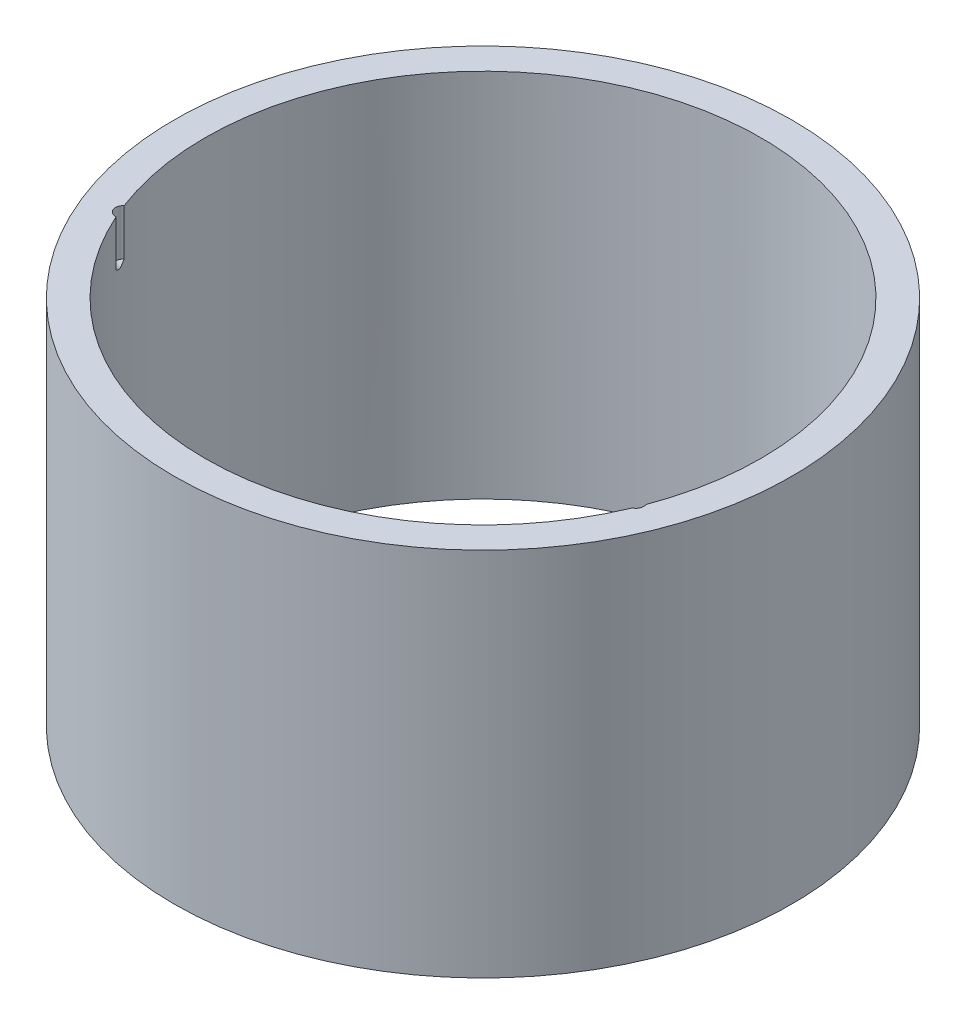
ISO-10303-21;
HEADER;
FILE_DESCRIPTION(('STEP AP214'),'2;1');
FILE_NAME('part.step','',(''),(''),'','','');
FILE_SCHEMA(('AUTOMOTIVE_DESIGN { 1 0 10303 214 1 1 1 1 }'));
ENDSEC;
DATA;
#1=APPLICATION_CONTEXT('core data for automotive mechanical design processes');
#2=APPLICATION_PROTOCOL_DEFINITION('international standard','automotive_design',2000,#1);
#3=PRODUCT_CONTEXT('',#1,'mechanical');
#4=PRODUCT('Part','Part','',(#3));
#5=PRODUCT_RELATED_PRODUCT_CATEGORY('part','',(#4));
#6=PRODUCT_DEFINITION_FORMATION('','',#4);
#7=PRODUCT_DEFINITION_CONTEXT('part definition',#1,'design');
#8=PRODUCT_DEFINITION('design','',#6,#7);
#9=PRODUCT_DEFINITION_SHAPE('','',#8);
#10=(LENGTH_UNIT() NAMED_UNIT(*) SI_UNIT(.MILLI.,.METRE.));
#11=(NAMED_UNIT(*) PLANE_ANGLE_UNIT() SI_UNIT($,.RADIAN.));
#12=(NAMED_UNIT(*) SI_UNIT($,.STERADIAN.) SOLID_ANGLE_UNIT());
#13=UNCERTAINTY_MEASURE_WITH_UNIT(LENGTH_MEASURE(1.E-05),#10,'distance_accuracy_value','');
#14=(GEOMETRIC_REPRESENTATION_CONTEXT(3) GLOBAL_UNCERTAINTY_ASSIGNED_CONTEXT((#13)) GLOBAL_UNIT_ASSIGNED_CONTEXT((#10,
#11,#12)) REPRESENTATION_CONTEXT('',''));
#15=CARTESIAN_POINT('',(0.,0.,0.));
#16=DIRECTION('',(0.,0.,1.));
#17=DIRECTION('',(1.,0.,0.));
#18=AXIS2_PLACEMENT_3D('',#15,#16,#17);
#19=CARTESIAN_POINT('',(0.,60.,0.));
#20=DIRECTION('',(0.,-1.,0.));
#21=DIRECTION('',(0.,0.,-1.));
#22=AXIS2_PLACEMENT_3D('',#19,#20,#21);
#23=CYLINDRICAL_SURFACE('',#22,50.);
#24=CARTESIAN_POINT('',(0.,60.,0.));
#25=DIRECTION('',(0.,1.,0.));
#26=DIRECTION('',(0.,0.,1.));
#27=AXIS2_PLACEMENT_3D('',#24,#25,#26);
#28=CIRCLE('',#27,50.);
#29=CARTESIAN_POINT('',(0.,60.,50.));
#30=VERTEX_POINT('',#29);
#31=EDGE_CURVE('E118',#30,#30,#28,.T.);
#32=ORIENTED_EDGE('',*,*,#31,.F.);
#33=EDGE_LOOP('',(#32));
#34=FACE_BOUND('',#33,.T.);
#35=CARTESIAN_POINT('',(0.,0.,0.));
#36=DIRECTION('',(0.,1.,0.));
#37=DIRECTION('',(0.,0.,1.));
#38=AXIS2_PLACEMENT_3D('',#35,#36,#37);
#39=CIRCLE('',#38,50.);
#40=CARTESIAN_POINT('',(0.,0.,50.));
#41=VERTEX_POINT('',#40);
#42=EDGE_CURVE('E119',#41,#41,#39,.T.);
#43=ORIENTED_EDGE('',*,*,#42,.T.);
#44=EDGE_LOOP('',(#43));
#45=FACE_BOUND('',#44,.T.);
#46=ADVANCED_FACE('F35',(#34,#45),#23,.T.);
#47=CARTESIAN_POINT('',(0.,60.,0.));
#48=DIRECTION('',(0.,1.,0.));
#49=DIRECTION('',(0.,0.,1.));
#50=AXIS2_PLACEMENT_3D('',#47,#48,#49);
#51=PLANE('',#50);
#52=CARTESIAN_POINT('',(-41.2106839133473,60.,17.0518973831552));
#53=DIRECTION('',(0.,1.,0.));
#54=DIRECTION('',(0.,0.,1.));
#55=AXIS2_PLACEMENT_3D('',#52,#53,#54);
#56=CIRCLE('',#55,1.25);
#57=CARTESIAN_POINT('',(-42.021195801066,60.,16.1002827133089));
#58=VERTEX_POINT('',#57);
#59=CARTESIAN_POINT('',(-41.1118449616113,60.,18.2979836007259));
#60=VERTEX_POINT('',#59);
#61=EDGE_CURVE('E83',#58,#60,#56,.T.);
#62=ORIENTED_EDGE('',*,*,#61,.F.);
#63=CARTESIAN_POINT('',(0.,60.,0.));
#64=DIRECTION('',(0.,1.,0.));
#65=DIRECTION('',(0.,0.,1.));
#66=AXIS2_PLACEMENT_3D('',#63,#64,#65);
#67=CIRCLE('',#66,45.);
#68=CARTESIAN_POINT('',(42.1507623145751,60.,15.757957872142));
#69=VERTEX_POINT('',#68);
#70=EDGE_CURVE('E89',#69,#58,#67,.T.);
#71=ORIENTED_EDGE('',*,*,#70,.F.);
#72=CARTESIAN_POINT('',(40.9854778022685,60.,16.2102984577394));
#73=DIRECTION('',(0.,1.,0.));
#74=DIRECTION('',(0.,0.,1.));
#75=AXIS2_PLACEMENT_3D('',#72,#73,#74);
#76=CIRCLE('',#75,1.25);
#77=CARTESIAN_POINT('',(41.526093730435,60.,17.3373452261624));
#78=VERTEX_POINT('',#77);
#79=EDGE_CURVE('E82',#78,#69,#76,.T.);
#80=ORIENTED_EDGE('',*,*,#79,.F.);
#81=EDGE_CURVE('E129',#60,#78,#67,.T.);
#82=ORIENTED_EDGE('',*,*,#81,.F.);
#83=EDGE_LOOP('',(#62,#71,#80,#82));
#84=FACE_BOUND('',#83,.T.);
#85=ORIENTED_EDGE('',*,*,#31,.T.);
#86=EDGE_LOOP('',(#85));
#87=FACE_BOUND('',#86,.T.);
#88=ADVANCED_FACE('F125',(#84,#87),#51,.T.);
#89=CARTESIAN_POINT('',(0.,0.,0.));
#90=DIRECTION('',(0.,1.,0.));
#91=DIRECTION('',(0.,0.,1.));
#92=AXIS2_PLACEMENT_3D('',#89,#90,#91);
#93=PLANE('',#92);
#94=CARTESIAN_POINT('',(0.,0.,0.));
#95=DIRECTION('',(0.,1.,0.));
#96=DIRECTION('',(0.,0.,1.));
#97=AXIS2_PLACEMENT_3D('',#94,#95,#96);
#98=CIRCLE('',#97,45.);
#99=CARTESIAN_POINT('',(0.,0.,45.));
#100=VERTEX_POINT('',#99);
#101=EDGE_CURVE('E128',#100,#100,#98,.T.);
#102=ORIENTED_EDGE('',*,*,#101,.T.);
#103=EDGE_LOOP('',(#102));
#104=FACE_BOUND('',#103,.T.);
#105=ORIENTED_EDGE('',*,*,#42,.F.);
#106=EDGE_LOOP('',(#105));
#107=FACE_BOUND('',#106,.T.);
#108=ADVANCED_FACE('F140',(#104,#107),#93,.F.);
#109=CARTESIAN_POINT('',(0.,0.,0.));
#110=DIRECTION('',(0.,1.,0.));
#111=DIRECTION('',(0.,0.,1.));
#112=AXIS2_PLACEMENT_3D('',#109,#110,#111);
#113=CYLINDRICAL_SURFACE('',#112,45.);
#114=ORIENTED_EDGE('',*,*,#101,.F.);
#115=EDGE_LOOP('',(#114));
#116=FACE_BOUND('',#115,.T.);
#117=CARTESIAN_POINT('',(-42.021322101842,52.5002,16.099953068666));
#118=CARTESIAN_POINT('',(-42.0029237455198,52.4710876726563,16.1479725469508));
#119=CARTESIAN_POINT('',(-41.9844194832855,52.4420895582519,16.1960235350014));
#120=CARTESIAN_POINT('',(-41.9471466794471,52.3845163075477,16.2923159363716));
#121=CARTESIAN_POINT('',(-41.9283779969646,52.3559414147522,16.3405574405218));
#122=CARTESIAN_POINT('',(-41.8901906998377,52.2989140166428,16.4382092007457));
#123=CARTESIAN_POINT('',(-41.8707664940072,52.270473776795,16.4876244511911));
#124=CARTESIAN_POINT('',(-41.8315302154229,52.2147139069246,16.5869205282583));
#125=CARTESIAN_POINT('',(-41.8117182498487,52.187393973527,16.6368012242874));
#126=CARTESIAN_POINT('',(-41.7809950585364,52.1471830796009,16.7137450204209));
#127=CARTESIAN_POINT('',(-41.770282991362,52.1335524704153,16.7404987835024));
#128=CARTESIAN_POINT('',(-41.7486652963879,52.1071298525664,16.7943379822933));
#129=CARTESIAN_POINT('',(-41.7377596936828,52.0943377361757,16.821423374863));
#130=CARTESIAN_POINT('',(-41.7157334666638,52.0700173364249,16.8759723605445));
#131=CARTESIAN_POINT('',(-41.7046135795999,52.0584854019707,16.9034345867844));
#132=CARTESIAN_POINT('',(-41.6820790663324,52.0372547809864,16.9589263700727));
#133=CARTESIAN_POINT('',(-41.6706645686708,52.0275553098019,16.9869556785805));
#134=CARTESIAN_POINT('',(-41.6431254050009,52.0077945155463,17.0543798734854));
#135=CARTESIAN_POINT('',(-41.6268348083234,51.9989528860929,17.0941072209923));
#136=CARTESIAN_POINT('',(-41.6021047809504,51.9916721350735,17.1541640718858));
#137=CARTESIAN_POINT('',(-41.5938368196668,51.9902377515598,17.1742018721902));
#138=CARTESIAN_POINT('',(-41.5772571685847,51.9894799322525,17.214300927401));
#139=CARTESIAN_POINT('',(-41.5689454802356,51.9901564269189,17.234362181513));
#140=CARTESIAN_POINT('',(-41.5503754371546,51.993956183943,17.2790919608768));
#141=CARTESIAN_POINT('',(-41.5401259648893,51.9976249141001,17.3037172693073));
#142=CARTESIAN_POINT('',(-41.519769159695,52.0075486730809,17.352506153002));
#143=CARTESIAN_POINT('',(-41.509661985078,52.0138063782393,17.3766692233082));
#144=CARTESIAN_POINT('',(-41.4894116027272,52.0283847791064,17.4249655639384));
#145=CARTESIAN_POINT('',(-41.479271944808,52.036745331211,17.4490879584124));
#146=CARTESIAN_POINT('',(-41.4591493148511,52.0548744720546,17.4968456956789));
#147=CARTESIAN_POINT('',(-41.449166306218,52.064642726338,17.5204811526424));
#148=CARTESIAN_POINT('',(-41.4246324359953,52.0900070863744,17.578430897674));
#149=CARTESIAN_POINT('',(-41.4101496427012,52.1061776991004,17.6125198958485));
#150=CARTESIAN_POINT('',(-41.3813337934528,52.1398165208318,17.6801177279499));
#151=CARTESIAN_POINT('',(-41.3670007846314,52.1572851250398,17.7136263813168));
#152=CARTESIAN_POINT('',(-41.3383985822883,52.1930796596419,17.7802733137003));
#153=CARTESIAN_POINT('',(-41.3241294984722,52.2114066952204,17.8134110432014));
#154=CARTESIAN_POINT('',(-41.2956275847176,52.2486231113191,17.8793857022925));
#155=CARTESIAN_POINT('',(-41.2813947567328,52.2675125214721,17.9122226159121));
#156=CARTESIAN_POINT('',(-41.2412649035369,52.3213254109312,18.0045074836976));
#157=CARTESIAN_POINT('',(-41.2153734051234,52.3566955683775,18.0636969154346));
#158=CARTESIAN_POINT('',(-41.1765073238516,52.4102310195505,18.1520322167531));
#159=CARTESIAN_POINT('',(-41.1635672149383,52.4281281265411,18.1813574510867));
#160=CARTESIAN_POINT('',(-41.1376580141789,52.4640650849578,18.2399045504799));
#161=CARTESIAN_POINT('',(-41.1246889242506,52.4821049271288,18.2691264220667));
#162=CARTESIAN_POINT('',(-41.1117014179485,52.5002,18.2983061107157));
#163=B_SPLINE_CURVE_WITH_KNOTS('',3,(#117,#118,#119,#120,#121,#122,#123,#124,#125,#126,#127,
#128,#129,#130,#131,#132,#133,#134,#135,#136,#137,#138,#139,#140,#141,#142,#143,#144,#145,#146,
#147,#148,#149,#150,#151,#152,#153,#154,#155,#156,#157,#158,#159,#160,#161,#162),.UNSPECIFIED.,
.F.,.F.,(4,2,2,2,2,2,2,2,2,2,2,2,2,2,2,2,2,2,2,2,2,2,4),(0.,0.177280342258364,0.354659004703489,
0.535352334047231,0.715996404710966,0.81162562345408,0.907242531814571,1.00257462490257,
1.09786580413024,1.22877241743713,1.29384928752234,1.35892401375875,1.43953114122428,
1.520221804773,1.60257533567866,1.68490933239255,1.8061056587497,1.92733903846094,
2.04873303677446,2.17013344300304,2.39108233813034,2.50121627293287,2.61134312416358),.UNSPECIFIED.);
#164=CARTESIAN_POINT('',(-42.021195801066,52.5,16.1002827133089));
#165=VERTEX_POINT('',#164);
#166=CARTESIAN_POINT('',(-41.1118449616113,52.5,18.297983600726));
#167=VERTEX_POINT('',#166);
#168=EDGE_CURVE('E73',#165,#167,#163,.T.);
#169=ORIENTED_EDGE('',*,*,#168,.T.);
#170=DIRECTION('',(0.,1.,0.));
#171=VECTOR('',#170,1.);
#172=CARTESIAN_POINT('',(-41.1118449616113,56.25,18.2979836007259));
#173=LINE('',#172,#171);
#174=EDGE_CURVE('E11',#167,#60,#173,.T.);
#175=ORIENTED_EDGE('',*,*,#174,.T.);
#176=ORIENTED_EDGE('',*,*,#81,.T.);
#177=DIRECTION('',(0.,1.,0.));
#178=VECTOR('',#177,1.);
#179=CARTESIAN_POINT('',(41.526093730435,56.25,17.3373452261624));
#180=LINE('',#179,#178);
#181=CARTESIAN_POINT('',(41.526093730435,52.5,17.3373452261624));
#182=VERTEX_POINT('',#181);
#183=EDGE_CURVE('E117',#78,#182,#180,.F.);
#184=ORIENTED_EDGE('',*,*,#183,.T.);
#185=CARTESIAN_POINT('',(41.525901032821,52.5002,17.3378067647658));
#186=CARTESIAN_POINT('',(41.539402962547,52.4861922022778,17.3054679720752));
#187=CARTESIAN_POINT('',(41.5529303555742,52.4725781856585,17.2729623806305));
#188=CARTESIAN_POINT('',(41.5800606141981,52.4463510545291,17.2075511367875));
#189=CARTESIAN_POINT('',(41.593663526999,52.4337386654789,17.1746452139742));
#190=CARTESIAN_POINT('',(41.6210852040721,52.4096300371792,17.1080850409303));
#191=CARTESIAN_POINT('',(41.634904771638,52.3981460945126,17.0744266066215));
#192=CARTESIAN_POINT('',(41.6626296639441,52.3767328583964,17.0066642936536));
#193=CARTESIAN_POINT('',(41.6765349719706,52.3668032713234,16.9725605004464));
#194=CARTESIAN_POINT('',(41.7169810920249,52.3407469288168,16.8730091190768));
#195=CARTESIAN_POINT('',(41.74364981743,52.3270675360792,16.8069295046529));
#196=CARTESIAN_POINT('',(41.7969886018466,52.3089104351444,16.6738371051464));
#197=CARTESIAN_POINT('',(41.8236579731232,52.3043865778063,16.6068307229799));
#198=CARTESIAN_POINT('',(41.8759686615284,52.3054325066341,16.474470709473));
#199=CARTESIAN_POINT('',(41.9016188682124,52.3107483216007,16.4091184190487));
#200=CARTESIAN_POINT('',(41.9522940527144,52.3298673239088,16.2791254628915));
#201=CARTESIAN_POINT('',(41.9773153476737,52.3437120042235,16.2144898584353));
#202=CARTESIAN_POINT('',(42.0277632313954,52.378584658066,16.083293135872));
#203=CARTESIAN_POINT('',(42.0531430445767,52.3999492315016,16.0168070877941));
#204=CARTESIAN_POINT('',(42.0904298864824,52.4353979407888,15.9184460873681));
#205=CARTESIAN_POINT('',(42.1026729791895,52.4477158358321,15.8860353062887));
#206=CARTESIAN_POINT('',(42.1269528093343,52.473296727055,15.8215369679933));
#207=CARTESIAN_POINT('',(42.1389896751915,52.4865591064333,15.7894492151709));
#208=CARTESIAN_POINT('',(42.1509374529995,52.5002,15.757489388647));
#209=B_SPLINE_CURVE_WITH_KNOTS('',3,(#185,#186,#187,#188,#189,#190,#191,#192,#193,#194,#195,
#196,#197,#198,#199,#200,#201,#202,#203,#204,#205,#206,#207,#208),.UNSPECIFIED.,.F.,.F.,(4,2,2,
2,2,2,2,2,2,2,2,4),(0.,0.113226396603065,0.226534066870695,0.340964358995098,0.45537300866246,
0.672571350902031,0.888672134746982,1.09927275739304,1.31090613404111,1.53356304642673,
1.64386607807272,1.75409772475502),.UNSPECIFIED.);
#210=CARTESIAN_POINT('',(42.150762314575,52.5,15.757957872142));
#211=VERTEX_POINT('',#210);
#212=EDGE_CURVE('E111',#182,#211,#209,.T.);
#213=ORIENTED_EDGE('',*,*,#212,.T.);
#214=DIRECTION('',(0.,1.,0.));
#215=VECTOR('',#214,1.);
#216=CARTESIAN_POINT('',(42.1507623145751,56.25,15.757957872142));
#217=LINE('',#216,#215);
#218=EDGE_CURVE('E77',#211,#69,#217,.T.);
#219=ORIENTED_EDGE('',*,*,#218,.T.);
#220=ORIENTED_EDGE('',*,*,#70,.T.);
#221=DIRECTION('',(0.,1.,0.));
#222=VECTOR('',#221,1.);
#223=CARTESIAN_POINT('',(-42.021195801066,56.25,16.1002827133089));
#224=LINE('',#223,#222);
#225=EDGE_CURVE('E42',#58,#165,#224,.F.);
#226=ORIENTED_EDGE('',*,*,#225,.T.);
#227=EDGE_LOOP('',(#169,#175,#176,#184,#213,#219,#220,#226));
#228=FACE_BOUND('',#227,.T.);
#229=ADVANCED_FACE('F86',(#116,#228),#113,.F.);
#230=CARTESIAN_POINT('',(40.9854778022685,60.,16.2102984577394));
#231=DIRECTION('',(0.,1.,0.));
#232=DIRECTION('',(0.,0.,1.));
#233=AXIS2_PLACEMENT_3D('',#230,#231,#232);
#234=CYLINDRICAL_SURFACE('',#233,1.25);
#235=CARTESIAN_POINT('',(40.9854778022685,52.5,16.2102984577394));
#236=DIRECTION('',(0.,1.,0.));
#237=DIRECTION('',(0.,0.,1.));
#238=AXIS2_PLACEMENT_3D('',#235,#236,#237);
#239=CIRCLE('',#238,1.25);
#240=EDGE_CURVE('E55',#182,#211,#239,.T.);
#241=ORIENTED_EDGE('',*,*,#240,.F.);
#242=ORIENTED_EDGE('',*,*,#183,.F.);
#243=ORIENTED_EDGE('',*,*,#79,.T.);
#244=ORIENTED_EDGE('',*,*,#218,.F.);
#245=EDGE_LOOP('',(#241,#242,#243,#244));
#246=FACE_BOUND('',#245,.T.);
#247=ADVANCED_FACE('F104',(#246),#234,.F.);
#248=CARTESIAN_POINT('',(40.9854778022685,52.5,16.2102984577394));
#249=DIRECTION('',(0.,1.,0.));
#250=DIRECTION('',(0.,0.,1.));
#251=AXIS2_PLACEMENT_3D('',#248,#249,#250);
#252=CONICAL_SURFACE('',#251,1.25,1.02974425867666);
#253=ORIENTED_EDGE('',*,*,#240,.T.);
#254=ORIENTED_EDGE('',*,*,#212,.F.);
#255=EDGE_LOOP('',(#253,#254));
#256=FACE_BOUND('',#255,.T.);
#257=ADVANCED_FACE('F106',(#256),#252,.F.);
#258=CARTESIAN_POINT('',(-41.2106839133473,60.,17.0518973831552));
#259=DIRECTION('',(0.,1.,0.));
#260=DIRECTION('',(0.,0.,1.));
#261=AXIS2_PLACEMENT_3D('',#258,#259,#260);
#262=CYLINDRICAL_SURFACE('',#261,1.25);
#263=CARTESIAN_POINT('',(-41.2106839133473,52.5,17.0518973831552));
#264=DIRECTION('',(0.,1.,0.));
#265=DIRECTION('',(0.,0.,1.));
#266=AXIS2_PLACEMENT_3D('',#263,#264,#265);
#267=CIRCLE('',#266,1.25);
#268=EDGE_CURVE('E48',#165,#167,#267,.T.);
#269=ORIENTED_EDGE('',*,*,#268,.F.);
#270=ORIENTED_EDGE('',*,*,#225,.F.);
#271=ORIENTED_EDGE('',*,*,#61,.T.);
#272=ORIENTED_EDGE('',*,*,#174,.F.);
#273=EDGE_LOOP('',(#269,#270,#271,#272));
#274=FACE_BOUND('',#273,.T.);
#275=ADVANCED_FACE('F80',(#274),#262,.F.);
#276=CARTESIAN_POINT('',(-41.2106839133473,52.5,17.0518973831552));
#277=DIRECTION('',(0.,1.,0.));
#278=DIRECTION('',(0.,0.,1.));
#279=AXIS2_PLACEMENT_3D('',#276,#277,#278);
#280=CONICAL_SURFACE('',#279,1.25,1.02974425867666);
#281=ORIENTED_EDGE('',*,*,#268,.T.);
#282=ORIENTED_EDGE('',*,*,#168,.F.);
#283=EDGE_LOOP('',(#281,#282));
#284=FACE_BOUND('',#283,.T.);
#285=ADVANCED_FACE('F74',(#284),#280,.F.);
#286=CLOSED_SHELL('',(#46,#88,#108,#229,#247,#257,#275,#285));
#287=MANIFOLD_SOLID_BREP('B2',#286);
#288=ADVANCED_BREP_SHAPE_REPRESENTATION('',(#18,#287),#14);
#289=SHAPE_DEFINITION_REPRESENTATION(#9,#288);
ENDSEC;
END-ISO-10303-21;
